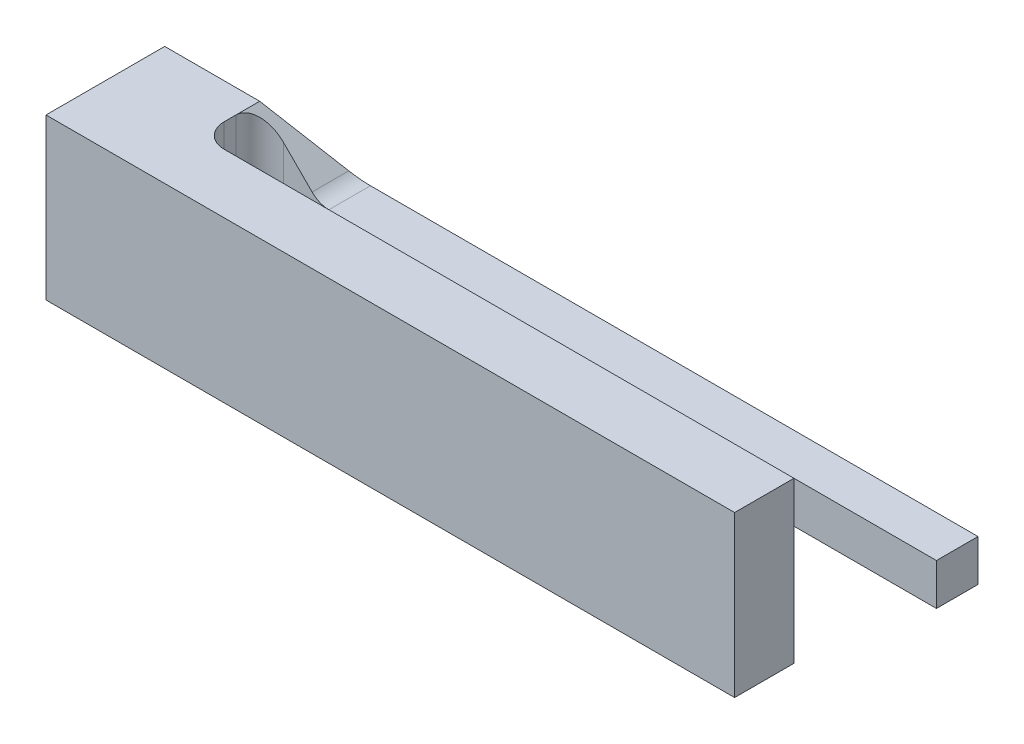
ISO-10303-21;
HEADER;
FILE_DESCRIPTION(('STEP AP214'),'2;1');
FILE_NAME('part.step','',(''),(''),'','','');
FILE_SCHEMA(('AUTOMOTIVE_DESIGN { 1 0 10303 214 1 1 1 1 }'));
ENDSEC;
DATA;
#1=APPLICATION_CONTEXT('core data for automotive mechanical design processes');
#2=APPLICATION_PROTOCOL_DEFINITION('international standard','automotive_design',2000,#1);
#3=PRODUCT_CONTEXT('',#1,'mechanical');
#4=PRODUCT('Part','Part','',(#3));
#5=PRODUCT_RELATED_PRODUCT_CATEGORY('part','',(#4));
#6=PRODUCT_DEFINITION_FORMATION('','',#4);
#7=PRODUCT_DEFINITION_CONTEXT('part definition',#1,'design');
#8=PRODUCT_DEFINITION('design','',#6,#7);
#9=PRODUCT_DEFINITION_SHAPE('','',#8);
#10=(LENGTH_UNIT() NAMED_UNIT(*) SI_UNIT(.MILLI.,.METRE.));
#11=(NAMED_UNIT(*) PLANE_ANGLE_UNIT() SI_UNIT($,.RADIAN.));
#12=(NAMED_UNIT(*) SI_UNIT($,.STERADIAN.) SOLID_ANGLE_UNIT());
#13=UNCERTAINTY_MEASURE_WITH_UNIT(LENGTH_MEASURE(1.E-05),#10,'distance_accuracy_value','');
#14=(GEOMETRIC_REPRESENTATION_CONTEXT(3) GLOBAL_UNCERTAINTY_ASSIGNED_CONTEXT((#13)) GLOBAL_UNIT_ASSIGNED_CONTEXT((#10,
#11,#12)) REPRESENTATION_CONTEXT('',''));
#15=CARTESIAN_POINT('',(0.,0.,0.));
#16=DIRECTION('',(0.,0.,1.));
#17=DIRECTION('',(1.,0.,0.));
#18=AXIS2_PLACEMENT_3D('',#15,#16,#17);
#19=CARTESIAN_POINT('',(-11.5661568524294,0.,13.5));
#20=DIRECTION('',(1.,0.,0.));
#21=DIRECTION('',(0.,1.,0.));
#22=AXIS2_PLACEMENT_3D('',#19,#20,#21);
#23=PLANE('',#22);
#24=DIRECTION('',(0.,0.,-1.));
#25=VECTOR('',#24,1.);
#26=CARTESIAN_POINT('',(-11.5661568524294,4.74903235504116,13.5));
#27=LINE('',#26,#25);
#28=CARTESIAN_POINT('',(-11.5661568524294,4.74903235504116,6.5));
#29=VERTEX_POINT('',#28);
#30=CARTESIAN_POINT('',(-11.5661568524294,4.74903235504116,5.5));
#31=VERTEX_POINT('',#30);
#32=EDGE_CURVE('E61',#29,#31,#27,.T.);
#33=ORIENTED_EDGE('',*,*,#32,.T.);
#34=DIRECTION('',(0.,-1.,0.));
#35=VECTOR('',#34,1.);
#36=CARTESIAN_POINT('',(-11.5661568524294,18.2490323550412,5.5));
#37=LINE('',#36,#35);
#38=CARTESIAN_POINT('',(-11.5661568524293,18.2490323550412,5.4999969652154));
#39=VERTEX_POINT('',#38);
#40=EDGE_CURVE('E264',#31,#39,#37,.F.);
#41=ORIENTED_EDGE('',*,*,#40,.T.);
#42=DIRECTION('',(0.,0.,-1.));
#43=VECTOR('',#42,1.);
#44=CARTESIAN_POINT('',(-11.5661568524294,18.2490323550412,13.5));
#45=LINE('',#44,#43);
#46=CARTESIAN_POINT('',(-11.5661568524294,18.2490323550412,6.5));
#47=VERTEX_POINT('',#46);
#48=EDGE_CURVE('E213',#47,#39,#45,.T.);
#49=ORIENTED_EDGE('',*,*,#48,.F.);
#50=DIRECTION('',(0.,1.,0.));
#51=VECTOR('',#50,1.);
#52=CARTESIAN_POINT('',(-11.5661568524294,0.,6.5));
#53=LINE('',#52,#51);
#54=EDGE_CURVE('E262',#47,#29,#53,.F.);
#55=ORIENTED_EDGE('',*,*,#54,.T.);
#56=EDGE_LOOP('',(#33,#41,#49,#55));
#57=FACE_BOUND('',#56,.T.);
#58=ADVANCED_FACE('F45',(#57),#23,.T.);
#59=CARTESIAN_POINT('',(-14.5661568524294,13.2490323550412,3.5));
#60=DIRECTION('',(0.,-1.,0.));
#61=DIRECTION('',(0.,0.,-1.));
#62=AXIS2_PLACEMENT_3D('',#59,#60,#61);
#63=PLANE('',#62);
#64=DIRECTION('',(-1.,0.,0.));
#65=VECTOR('',#64,1.);
#66=CARTESIAN_POINT('',(-14.5661568524294,13.2490323550412,0.));
#67=LINE('',#66,#65);
#68=CARTESIAN_POINT('',(45.4338431475706,13.2490323550412,0.));
#69=VERTEX_POINT('',#68);
#70=CARTESIAN_POINT('',(-5.73772972768318,13.2490323550412,0.));
#71=VERTEX_POINT('',#70);
#72=EDGE_CURVE('E228',#69,#71,#67,.T.);
#73=ORIENTED_EDGE('',*,*,#72,.T.);
#74=DIRECTION('',(0.,0.,1.));
#75=VECTOR('',#74,1.);
#76=CARTESIAN_POINT('',(-5.73772972768317,13.2490323550412,3.5));
#77=LINE('',#76,#75);
#78=CARTESIAN_POINT('',(-5.73772972768318,13.2490323550412,3.5));
#79=VERTEX_POINT('',#78);
#80=EDGE_CURVE('E249',#71,#79,#77,.T.);
#81=ORIENTED_EDGE('',*,*,#80,.T.);
#82=DIRECTION('',(-1.,0.,0.));
#83=VECTOR('',#82,1.);
#84=CARTESIAN_POINT('',(-14.5661568524294,13.2490323550412,3.5));
#85=LINE('',#84,#83);
#86=CARTESIAN_POINT('',(45.4338431475706,13.2490323550412,3.5));
#87=VERTEX_POINT('',#86);
#88=EDGE_CURVE('E219',#87,#79,#85,.T.);
#89=ORIENTED_EDGE('',*,*,#88,.F.);
#90=DIRECTION('',(0.,0.,-1.));
#91=VECTOR('',#90,1.);
#92=CARTESIAN_POINT('',(45.4338431475706,13.2490323550412,3.5));
#93=LINE('',#92,#91);
#94=EDGE_CURVE('E235',#87,#69,#93,.T.);
#95=ORIENTED_EDGE('',*,*,#94,.T.);
#96=EDGE_LOOP('',(#73,#81,#89,#95));
#97=FACE_BOUND('',#96,.T.);
#98=ADVANCED_FACE('F324',(#97),#63,.F.);
#99=CARTESIAN_POINT('',(-14.5661568524294,9.74903235504116,3.5));
#100=DIRECTION('',(0.,1.,0.));
#101=DIRECTION('',(0.,0.,1.));
#102=AXIS2_PLACEMENT_3D('',#99,#100,#101);
#103=PLANE('',#102);
#104=DIRECTION('',(1.,0.,0.));
#105=VECTOR('',#104,1.);
#106=CARTESIAN_POINT('',(-14.5661568524294,9.74903235504116,3.5));
#107=LINE('',#106,#105);
#108=CARTESIAN_POINT('',(-5.73772972768318,9.74903235504116,3.5));
#109=VERTEX_POINT('',#108);
#110=CARTESIAN_POINT('',(45.4338431475706,9.74903235504116,3.5));
#111=VERTEX_POINT('',#110);
#112=EDGE_CURVE('E223',#109,#111,#107,.T.);
#113=ORIENTED_EDGE('',*,*,#112,.F.);
#114=DIRECTION('',(0.,0.,-1.));
#115=VECTOR('',#114,1.);
#116=CARTESIAN_POINT('',(-5.73772972768317,9.74903235504116,0.));
#117=LINE('',#116,#115);
#118=CARTESIAN_POINT('',(-5.73772972768318,9.74903235504116,0.));
#119=VERTEX_POINT('',#118);
#120=EDGE_CURVE('E254',#109,#119,#117,.T.);
#121=ORIENTED_EDGE('',*,*,#120,.T.);
#122=DIRECTION('',(1.,0.,0.));
#123=VECTOR('',#122,1.);
#124=CARTESIAN_POINT('',(-14.5661568524294,9.74903235504116,0.));
#125=LINE('',#124,#123);
#126=CARTESIAN_POINT('',(45.4338431475706,9.74903235504116,0.));
#127=VERTEX_POINT('',#126);
#128=EDGE_CURVE('E231',#119,#127,#125,.T.);
#129=ORIENTED_EDGE('',*,*,#128,.T.);
#130=DIRECTION('',(0.,0.,-1.));
#131=VECTOR('',#130,1.);
#132=CARTESIAN_POINT('',(45.4338431475706,9.74903235504116,3.5));
#133=LINE('',#132,#131);
#134=EDGE_CURVE('E225',#111,#127,#133,.T.);
#135=ORIENTED_EDGE('',*,*,#134,.F.);
#136=EDGE_LOOP('',(#113,#121,#129,#135));
#137=FACE_BOUND('',#136,.T.);
#138=ADVANCED_FACE('F330',(#137),#103,.F.);
#139=CARTESIAN_POINT('',(0.,0.,3.5));
#140=DIRECTION('',(0.,0.,1.));
#141=DIRECTION('',(1.,0.,0.));
#142=AXIS2_PLACEMENT_3D('',#139,#140,#141);
#143=PLANE('',#142);
#144=DIRECTION('',(-0.707106781186544,0.707106781186551,0.));
#145=VECTOR('',#144,1.);
#146=CARTESIAN_POINT('',(-11.5661568524294,18.2490323550412,3.5));
#147=LINE('',#146,#145);
#148=CARTESIAN_POINT('',(-7.15194329005628,13.8348187926681,3.5));
#149=VERTEX_POINT('',#148);
#150=CARTESIAN_POINT('',(-9.5661568524294,16.2490323550412,3.5));
#151=VERTEX_POINT('',#150);
#152=EDGE_CURVE('E246',#149,#151,#147,.T.);
#153=ORIENTED_EDGE('',*,*,#152,.T.);
#154=DIRECTION('',(0.,-1.,0.));
#155=VECTOR('',#154,1.);
#156=CARTESIAN_POINT('',(-9.5661568524294,4.74903235504116,3.5));
#157=LINE('',#156,#155);
#158=CARTESIAN_POINT('',(-9.5661568524294,6.74903235504109,3.5));
#159=VERTEX_POINT('',#158);
#160=EDGE_CURVE('E259',#151,#159,#157,.T.);
#161=ORIENTED_EDGE('',*,*,#160,.T.);
#162=DIRECTION('',(0.707106781186544,0.707106781186551,0.));
#163=VECTOR('',#162,1.);
#164=CARTESIAN_POINT('',(-11.5661568524294,4.74903235504107,3.5));
#165=LINE('',#164,#163);
#166=CARTESIAN_POINT('',(-7.15194329005627,9.16324591741425,3.5));
#167=VERTEX_POINT('',#166);
#168=EDGE_CURVE('E238',#159,#167,#165,.T.);
#169=ORIENTED_EDGE('',*,*,#168,.T.);
#170=CARTESIAN_POINT('',(-5.73772972768317,7.74903235504116,3.5));
#171=DIRECTION('',(0.,0.,1.));
#172=DIRECTION('',(1.,0.,0.));
#173=AXIS2_PLACEMENT_3D('',#170,#171,#172);
#174=CIRCLE('',#173,2.);
#175=EDGE_CURVE('E275',#167,#109,#174,.F.);
#176=ORIENTED_EDGE('',*,*,#175,.T.);
#177=ORIENTED_EDGE('',*,*,#112,.T.);
#178=DIRECTION('',(0.,1.,0.));
#179=VECTOR('',#178,1.);
#180=CARTESIAN_POINT('',(45.4338431475706,13.2490323550412,3.5));
#181=LINE('',#180,#179);
#182=EDGE_CURVE('E216',#111,#87,#181,.T.);
#183=ORIENTED_EDGE('',*,*,#182,.T.);
#184=ORIENTED_EDGE('',*,*,#88,.T.);
#185=CARTESIAN_POINT('',(-5.73772972768317,15.2490323550412,3.5));
#186=DIRECTION('',(0.,0.,1.));
#187=DIRECTION('',(1.,0.,0.));
#188=AXIS2_PLACEMENT_3D('',#185,#186,#187);
#189=CIRCLE('',#188,2.);
#190=EDGE_CURVE('E269',#79,#149,#189,.F.);
#191=ORIENTED_EDGE('',*,*,#190,.T.);
#192=EDGE_LOOP('',(#153,#161,#169,#176,#177,#183,#184,#191));
#193=FACE_BOUND('',#192,.T.);
#194=ADVANCED_FACE('F335',(#193),#143,.T.);
#195=CARTESIAN_POINT('',(45.4338431475706,13.2490323550412,3.5));
#196=DIRECTION('',(-1.,0.,0.));
#197=DIRECTION('',(0.,0.,1.));
#198=AXIS2_PLACEMENT_3D('',#195,#196,#197);
#199=PLANE('',#198);
#200=DIRECTION('',(0.,1.,0.));
#201=VECTOR('',#200,1.);
#202=CARTESIAN_POINT('',(45.4338431475706,13.2490323550412,0.));
#203=LINE('',#202,#201);
#204=EDGE_CURVE('E215',#127,#69,#203,.T.);
#205=ORIENTED_EDGE('',*,*,#204,.T.);
#206=ORIENTED_EDGE('',*,*,#94,.F.);
#207=ORIENTED_EDGE('',*,*,#182,.F.);
#208=ORIENTED_EDGE('',*,*,#134,.T.);
#209=EDGE_LOOP('',(#205,#206,#207,#208));
#210=FACE_BOUND('',#209,.T.);
#211=ADVANCED_FACE('F338',(#210),#199,.F.);
#212=CARTESIAN_POINT('',(0.,0.,0.));
#213=DIRECTION('',(0.,0.,1.));
#214=DIRECTION('',(1.,0.,0.));
#215=AXIS2_PLACEMENT_3D('',#212,#213,#214);
#216=PLANE('',#215);
#217=ORIENTED_EDGE('',*,*,#204,.F.);
#218=ORIENTED_EDGE('',*,*,#128,.F.);
#219=CARTESIAN_POINT('',(-19.5661568524294,9.74903235504116,0.));
#220=VERTEX_POINT('',#219);
#221=EDGE_CURVE('E220',#220,#119,#125,.T.);
#222=ORIENTED_EDGE('',*,*,#221,.F.);
#223=DIRECTION('',(0.,-1.,0.));
#224=VECTOR('',#223,1.);
#225=CARTESIAN_POINT('',(-19.5661568524294,13.2490323550412,0.));
#226=LINE('',#225,#224);
#227=CARTESIAN_POINT('',(-19.5661568524294,13.2490323550412,0.));
#228=VERTEX_POINT('',#227);
#229=EDGE_CURVE('E173',#228,#220,#226,.T.);
#230=ORIENTED_EDGE('',*,*,#229,.F.);
#231=DIRECTION('',(-1.,0.,0.));
#232=VECTOR('',#231,1.);
#233=CARTESIAN_POINT('',(-11.5661568524294,13.2490323550412,0.));
#234=LINE('',#233,#232);
#235=EDGE_CURVE('E164',#71,#228,#234,.T.);
#236=ORIENTED_EDGE('',*,*,#235,.F.);
#237=ORIENTED_EDGE('',*,*,#72,.F.);
#238=EDGE_LOOP('',(#217,#218,#222,#230,#236,#237));
#239=FACE_BOUND('',#238,.T.);
#240=ADVANCED_FACE('F340',(#239),#216,.F.);
#241=CARTESIAN_POINT('',(0.,18.2490323550412,13.5));
#242=DIRECTION('',(0.,1.,0.));
#243=DIRECTION('',(0.,0.,1.));
#244=AXIS2_PLACEMENT_3D('',#241,#242,#243);
#245=PLANE('',#244);
#246=DIRECTION('',(1.,0.,0.));
#247=VECTOR('',#246,1.);
#248=CARTESIAN_POINT('',(0.,18.2490323550412,3.5));
#249=LINE('',#248,#247);
#250=CARTESIAN_POINT('',(-19.5661568524294,18.2490323550412,3.5));
#251=VERTEX_POINT('',#250);
#252=CARTESIAN_POINT('',(-11.5661568524294,18.2490323550412,3.5));
#253=VERTEX_POINT('',#252);
#254=EDGE_CURVE('E154',#251,#253,#249,.T.);
#255=ORIENTED_EDGE('',*,*,#254,.F.);
#256=DIRECTION('',(0.,0.,-1.));
#257=VECTOR('',#256,1.);
#258=CARTESIAN_POINT('',(-19.5661568524294,18.2490323550412,13.5));
#259=LINE('',#258,#257);
#260=CARTESIAN_POINT('',(-19.5661568524294,18.2490323550412,13.5));
#261=VERTEX_POINT('',#260);
#262=EDGE_CURVE('E158',#261,#251,#259,.T.);
#263=ORIENTED_EDGE('',*,*,#262,.F.);
#264=DIRECTION('',(1.,0.,0.));
#265=VECTOR('',#264,1.);
#266=CARTESIAN_POINT('',(0.,18.2490323550412,13.5));
#267=LINE('',#266,#265);
#268=CARTESIAN_POINT('',(38.4338431475706,18.2490323550413,13.5));
#269=VERTEX_POINT('',#268);
#270=EDGE_CURVE('E206',#261,#269,#267,.T.);
#271=ORIENTED_EDGE('',*,*,#270,.T.);
#272=DIRECTION('',(0.,0.,-1.));
#273=VECTOR('',#272,1.);
#274=CARTESIAN_POINT('',(38.4338431475706,18.2490323550412,0.));
#275=LINE('',#274,#273);
#276=CARTESIAN_POINT('',(38.4338431475706,18.2490323550412,8.5));
#277=VERTEX_POINT('',#276);
#278=EDGE_CURVE('E196',#269,#277,#275,.T.);
#279=ORIENTED_EDGE('',*,*,#278,.T.);
#280=DIRECTION('',(-1.,0.,0.));
#281=VECTOR('',#280,1.);
#282=CARTESIAN_POINT('',(38.4338431475706,18.2490323550412,8.5));
#283=LINE('',#282,#281);
#284=CARTESIAN_POINT('',(-9.5661568524294,18.2490323550412,8.5));
#285=VERTEX_POINT('',#284);
#286=EDGE_CURVE('E199',#277,#285,#283,.T.);
#287=ORIENTED_EDGE('',*,*,#286,.T.);
#288=CARTESIAN_POINT('',(-9.56615685242941,18.2490323550412,6.5));
#289=DIRECTION('',(0.,1.,0.));
#290=DIRECTION('',(0.,0.,1.));
#291=AXIS2_PLACEMENT_3D('',#288,#289,#290);
#292=CIRCLE('',#291,2.);
#293=EDGE_CURVE('E281',#285,#47,#292,.F.);
#294=ORIENTED_EDGE('',*,*,#293,.T.);
#295=ORIENTED_EDGE('',*,*,#48,.T.);
#296=DIRECTION('',(0.,0.,1.));
#297=VECTOR('',#296,1.);
#298=CARTESIAN_POINT('',(-11.5661568524293,18.2490323550412,13.5));
#299=LINE('',#298,#297);
#300=EDGE_CURVE('E11',#253,#39,#299,.T.);
#301=ORIENTED_EDGE('',*,*,#300,.F.);
#302=EDGE_LOOP('',(#255,#263,#271,#279,#287,#294,#295,#301));
#303=FACE_BOUND('',#302,.T.);
#304=ADVANCED_FACE('F156',(#303),#245,.T.);
#305=CARTESIAN_POINT('',(0.,4.74903235504116,13.5));
#306=DIRECTION('',(0.,1.,0.));
#307=DIRECTION('',(0.,0.,1.));
#308=AXIS2_PLACEMENT_3D('',#305,#306,#307);
#309=PLANE('',#308);
#310=DIRECTION('',(1.,0.,0.));
#311=VECTOR('',#310,1.);
#312=CARTESIAN_POINT('',(0.,4.74903235504116,3.5));
#313=LINE('',#312,#311);
#314=CARTESIAN_POINT('',(-19.5661568524294,4.74903235504116,3.5));
#315=VERTEX_POINT('',#314);
#316=CARTESIAN_POINT('',(-11.5661568524294,4.74903235504116,3.5));
#317=VERTEX_POINT('',#316);
#318=EDGE_CURVE('E163',#315,#317,#313,.T.);
#319=ORIENTED_EDGE('',*,*,#318,.T.);
#320=DIRECTION('',(0.,0.,1.));
#321=VECTOR('',#320,1.);
#322=CARTESIAN_POINT('',(-11.5661568524293,4.74903235504116,13.5));
#323=LINE('',#322,#321);
#324=EDGE_CURVE('E54',#317,#31,#323,.T.);
#325=ORIENTED_EDGE('',*,*,#324,.T.);
#326=ORIENTED_EDGE('',*,*,#32,.F.);
#327=CARTESIAN_POINT('',(-9.5661568524294,4.74903235504116,6.5));
#328=DIRECTION('',(0.,1.,0.));
#329=DIRECTION('',(0.,0.,1.));
#330=AXIS2_PLACEMENT_3D('',#327,#328,#329);
#331=CIRCLE('',#330,2.);
#332=CARTESIAN_POINT('',(-9.5661568524294,4.74903235504116,8.5));
#333=VERTEX_POINT('',#332);
#334=EDGE_CURVE('E283',#29,#333,#331,.T.);
#335=ORIENTED_EDGE('',*,*,#334,.T.);
#336=DIRECTION('',(-1.,0.,0.));
#337=VECTOR('',#336,1.);
#338=CARTESIAN_POINT('',(38.4338431475706,4.74903235504116,8.5));
#339=LINE('',#338,#337);
#340=CARTESIAN_POINT('',(38.4338431475706,4.74903235504116,8.5));
#341=VERTEX_POINT('',#340);
#342=EDGE_CURVE('E202',#341,#333,#339,.T.);
#343=ORIENTED_EDGE('',*,*,#342,.F.);
#344=DIRECTION('',(0.,0.,-1.));
#345=VECTOR('',#344,1.);
#346=CARTESIAN_POINT('',(38.4338431475706,4.74903235504116,0.));
#347=LINE('',#346,#345);
#348=CARTESIAN_POINT('',(38.4338431475706,4.74903235504116,13.5));
#349=VERTEX_POINT('',#348);
#350=EDGE_CURVE('E192',#349,#341,#347,.T.);
#351=ORIENTED_EDGE('',*,*,#350,.F.);
#352=DIRECTION('',(1.,0.,0.));
#353=VECTOR('',#352,1.);
#354=CARTESIAN_POINT('',(0.,4.74903235504116,13.5));
#355=LINE('',#354,#353);
#356=CARTESIAN_POINT('',(-19.5661568524294,4.74903235504116,13.5));
#357=VERTEX_POINT('',#356);
#358=EDGE_CURVE('E208',#357,#349,#355,.T.);
#359=ORIENTED_EDGE('',*,*,#358,.F.);
#360=DIRECTION('',(0.,0.,1.));
#361=VECTOR('',#360,1.);
#362=CARTESIAN_POINT('',(-19.5661568524294,4.74903235504116,3.5));
#363=LINE('',#362,#361);
#364=EDGE_CURVE('E186',#315,#357,#363,.T.);
#365=ORIENTED_EDGE('',*,*,#364,.F.);
#366=EDGE_LOOP('',(#319,#325,#326,#335,#343,#351,#359,#365));
#367=FACE_BOUND('',#366,.T.);
#368=ADVANCED_FACE('F287',(#367),#309,.F.);
#369=CARTESIAN_POINT('',(0.,0.,13.5));
#370=DIRECTION('',(0.,0.,1.));
#371=DIRECTION('',(1.,0.,0.));
#372=AXIS2_PLACEMENT_3D('',#369,#370,#371);
#373=PLANE('',#372);
#374=ORIENTED_EDGE('',*,*,#358,.T.);
#375=DIRECTION('',(0.,-1.,0.));
#376=VECTOR('',#375,1.);
#377=CARTESIAN_POINT('',(38.4338431475706,0.,13.5));
#378=LINE('',#377,#376);
#379=EDGE_CURVE('E189',#269,#349,#378,.T.);
#380=ORIENTED_EDGE('',*,*,#379,.F.);
#381=ORIENTED_EDGE('',*,*,#270,.F.);
#382=DIRECTION('',(0.,1.,0.));
#383=VECTOR('',#382,1.);
#384=CARTESIAN_POINT('',(-19.5661568524294,4.74903235504116,13.5));
#385=LINE('',#384,#383);
#386=EDGE_CURVE('E179',#357,#261,#385,.T.);
#387=ORIENTED_EDGE('',*,*,#386,.F.);
#388=EDGE_LOOP('',(#374,#380,#381,#387));
#389=FACE_BOUND('',#388,.T.);
#390=ADVANCED_FACE('F311',(#389),#373,.T.);
#391=CARTESIAN_POINT('',(-11.5661568524294,3.20605762011421,4.58008231444887));
#392=DIRECTION('',(0.,-0.573462344363328,-0.81923192051904));
#393=DIRECTION('',(0.,0.81923192051904,-0.573462344363328));
#394=AXIS2_PLACEMENT_3D('',#391,#392,#393);
#395=PLANE('',#394);
#396=ORIENTED_EDGE('',*,*,#318,.F.);
#397=DIRECTION('',(0.,-0.81923192051904,0.573462344363328));
#398=VECTOR('',#397,1.);
#399=CARTESIAN_POINT('',(-19.5661568524294,9.74903235504116,0.));
#400=LINE('',#399,#398);
#401=EDGE_CURVE('E183',#220,#315,#400,.T.);
#402=ORIENTED_EDGE('',*,*,#401,.F.);
#403=ORIENTED_EDGE('',*,*,#221,.T.);
#404=CARTESIAN_POINT('',(-5.73772972768317,7.74903235504116,1.4));
#405=DIRECTION('',(0.,-0.573462344363328,-0.81923192051904));
#406=DIRECTION('',(0.,-0.81923192051904,0.573462344363328));
#407=AXIS2_PLACEMENT_3D('',#404,#405,#406);
#408=ELLIPSE('',#407,2.44131112314674,2.);
#409=CARTESIAN_POINT('',(-7.15194329005627,9.16324591741425,0.410050506338837));
#410=VERTEX_POINT('',#409);
#411=EDGE_CURVE('E273',#119,#410,#408,.F.);
#412=ORIENTED_EDGE('',*,*,#411,.T.);
#413=DIRECTION('',(-0.633724250524474,-0.633724250524481,0.443606975367137));
#414=VECTOR('',#413,1.);
#415=CARTESIAN_POINT('',(-14.3774018323491,1.93778737512139,5.46787148594384));
#416=LINE('',#415,#414);
#417=EDGE_CURVE('E241',#410,#317,#416,.T.);
#418=ORIENTED_EDGE('',*,*,#417,.T.);
#419=EDGE_LOOP('',(#396,#402,#403,#412,#418));
#420=FACE_BOUND('',#419,.T.);
#421=ADVANCED_FACE('F313',(#420),#395,.T.);
#422=CARTESIAN_POINT('',(-11.5661568524294,4.3570643315236,-6.22437761646229));
#423=DIRECTION('',(0.,0.573462344363328,-0.819231920519041));
#424=DIRECTION('',(0.,0.819231920519041,0.573462344363328));
#425=AXIS2_PLACEMENT_3D('',#422,#423,#424);
#426=PLANE('',#425);
#427=ORIENTED_EDGE('',*,*,#235,.T.);
#428=DIRECTION('',(0.,-0.819231920519041,-0.573462344363328));
#429=VECTOR('',#428,1.);
#430=CARTESIAN_POINT('',(-19.5661568524294,18.2490323550412,3.5));
#431=LINE('',#430,#429);
#432=EDGE_CURVE('E167',#251,#228,#431,.T.);
#433=ORIENTED_EDGE('',*,*,#432,.F.);
#434=ORIENTED_EDGE('',*,*,#254,.T.);
#435=DIRECTION('',(0.633724250524474,-0.633724250524481,-0.443606975367136));
#436=VECTOR('',#435,1.);
#437=CARTESIAN_POINT('',(-14.3774018323491,21.0602773349609,5.46787148594384));
#438=LINE('',#437,#436);
#439=CARTESIAN_POINT('',(-7.15194329005627,13.8348187926681,0.410050506338835));
#440=VERTEX_POINT('',#439);
#441=EDGE_CURVE('E244',#253,#440,#438,.T.);
#442=ORIENTED_EDGE('',*,*,#441,.T.);
#443=CARTESIAN_POINT('',(-5.73772972768317,15.2490323550412,1.4));
#444=DIRECTION('',(0.,0.573462344363328,-0.819231920519041));
#445=DIRECTION('',(0.,-0.819231920519041,-0.573462344363328));
#446=AXIS2_PLACEMENT_3D('',#443,#444,#445);
#447=ELLIPSE('',#446,2.44131112314674,2.);
#448=EDGE_CURVE('E271',#440,#71,#447,.F.);
#449=ORIENTED_EDGE('',*,*,#448,.T.);
#450=EDGE_LOOP('',(#427,#433,#434,#442,#449));
#451=FACE_BOUND('',#450,.T.);
#452=ADVANCED_FACE('F168',(#451),#426,.T.);
#453=CARTESIAN_POINT('',(38.4338431475706,0.,8.5));
#454=DIRECTION('',(0.,0.,1.));
#455=DIRECTION('',(1.,0.,0.));
#456=AXIS2_PLACEMENT_3D('',#453,#454,#455);
#457=PLANE('',#456);
#458=ORIENTED_EDGE('',*,*,#342,.T.);
#459=DIRECTION('',(0.,1.,0.));
#460=VECTOR('',#459,1.);
#461=CARTESIAN_POINT('',(-9.5661568524294,0.,8.5));
#462=LINE('',#461,#460);
#463=EDGE_CURVE('E266',#333,#285,#462,.T.);
#464=ORIENTED_EDGE('',*,*,#463,.T.);
#465=ORIENTED_EDGE('',*,*,#286,.F.);
#466=DIRECTION('',(0.,1.,0.));
#467=VECTOR('',#466,1.);
#468=CARTESIAN_POINT('',(38.4338431475706,0.,8.5));
#469=LINE('',#468,#467);
#470=EDGE_CURVE('E194',#341,#277,#469,.T.);
#471=ORIENTED_EDGE('',*,*,#470,.F.);
#472=EDGE_LOOP('',(#458,#464,#465,#471));
#473=FACE_BOUND('',#472,.T.);
#474=ADVANCED_FACE('F302',(#473),#457,.F.);
#475=CARTESIAN_POINT('',(38.4338431475706,0.,0.));
#476=DIRECTION('',(1.,0.,0.));
#477=DIRECTION('',(0.,1.,0.));
#478=AXIS2_PLACEMENT_3D('',#475,#476,#477);
#479=PLANE('',#478);
#480=ORIENTED_EDGE('',*,*,#379,.T.);
#481=ORIENTED_EDGE('',*,*,#350,.T.);
#482=ORIENTED_EDGE('',*,*,#470,.T.);
#483=ORIENTED_EDGE('',*,*,#278,.F.);
#484=EDGE_LOOP('',(#480,#481,#482,#483));
#485=FACE_BOUND('',#484,.T.);
#486=ADVANCED_FACE('F309',(#485),#479,.T.);
#487=CARTESIAN_POINT('',(-11.5661568524294,4.74903235504107,13.5));
#488=DIRECTION('',(-0.707106781186551,0.707106781186544,0.));
#489=DIRECTION('',(0.,0.,1.));
#490=AXIS2_PLACEMENT_3D('',#487,#488,#489);
#491=PLANE('',#490);
#492=ORIENTED_EDGE('',*,*,#417,.F.);
#493=DIRECTION('',(0.,0.,-1.));
#494=VECTOR('',#493,1.);
#495=CARTESIAN_POINT('',(-7.15194329005628,9.16324591741425,3.5));
#496=LINE('',#495,#494);
#497=EDGE_CURVE('E257',#410,#167,#496,.F.);
#498=ORIENTED_EDGE('',*,*,#497,.T.);
#499=ORIENTED_EDGE('',*,*,#168,.F.);
#500=CARTESIAN_POINT('',(-9.5661568524294,6.74903235504109,5.5));
#501=DIRECTION('',(-0.707106781186551,0.707106781186544,0.));
#502=DIRECTION('',(0.707106781186544,0.707106781186551,0.));
#503=AXIS2_PLACEMENT_3D('',#500,#501,#502);
#504=ELLIPSE('',#503,2.8284271247462,2.);
#505=EDGE_CURVE('E277',#159,#31,#504,.T.);
#506=ORIENTED_EDGE('',*,*,#505,.T.);
#507=ORIENTED_EDGE('',*,*,#324,.F.);
#508=EDGE_LOOP('',(#492,#498,#499,#506,#507));
#509=FACE_BOUND('',#508,.T.);
#510=ADVANCED_FACE('F351',(#509),#491,.F.);
#511=CARTESIAN_POINT('',(-11.5661568524294,18.2490323550412,13.5));
#512=DIRECTION('',(-0.707106781186551,-0.707106781186544,0.));
#513=DIRECTION('',(0.,0.,-1.));
#514=AXIS2_PLACEMENT_3D('',#511,#512,#513);
#515=PLANE('',#514);
#516=ORIENTED_EDGE('',*,*,#152,.F.);
#517=DIRECTION('',(0.,0.,1.));
#518=VECTOR('',#517,1.);
#519=CARTESIAN_POINT('',(-7.15194329005628,13.8348187926681,0.));
#520=LINE('',#519,#518);
#521=EDGE_CURVE('E252',#149,#440,#520,.F.);
#522=ORIENTED_EDGE('',*,*,#521,.T.);
#523=ORIENTED_EDGE('',*,*,#441,.F.);
#524=ORIENTED_EDGE('',*,*,#300,.T.);
#525=CARTESIAN_POINT('',(-9.5661568524294,16.2490323550412,5.5));
#526=DIRECTION('',(-0.707106781186551,-0.707106781186544,0.));
#527=DIRECTION('',(-0.707106781186544,0.707106781186551,0.));
#528=AXIS2_PLACEMENT_3D('',#525,#526,#527);
#529=ELLIPSE('',#528,2.82842712474621,2.);
#530=EDGE_CURVE('E279',#39,#151,#529,.T.);
#531=ORIENTED_EDGE('',*,*,#530,.T.);
#532=EDGE_LOOP('',(#516,#522,#523,#524,#531));
#533=FACE_BOUND('',#532,.T.);
#534=ADVANCED_FACE('F357',(#533),#515,.F.);
#535=CARTESIAN_POINT('',(-5.73772972768317,15.2490323550412,3.5));
#536=DIRECTION('',(0.,0.,-1.));
#537=DIRECTION('',(-1.,0.,0.));
#538=AXIS2_PLACEMENT_3D('',#535,#536,#537);
#539=CYLINDRICAL_SURFACE('',#538,2.);
#540=ORIENTED_EDGE('',*,*,#448,.F.);
#541=ORIENTED_EDGE('',*,*,#521,.F.);
#542=ORIENTED_EDGE('',*,*,#190,.F.);
#543=ORIENTED_EDGE('',*,*,#80,.F.);
#544=EDGE_LOOP('',(#540,#541,#542,#543));
#545=FACE_BOUND('',#544,.T.);
#546=ADVANCED_FACE('F362',(#545),#539,.F.);
#547=CARTESIAN_POINT('',(-5.73772972768317,7.74903235504116,3.5));
#548=DIRECTION('',(0.,0.,1.));
#549=DIRECTION('',(1.,0.,0.));
#550=AXIS2_PLACEMENT_3D('',#547,#548,#549);
#551=CYLINDRICAL_SURFACE('',#550,2.);
#552=ORIENTED_EDGE('',*,*,#175,.F.);
#553=ORIENTED_EDGE('',*,*,#497,.F.);
#554=ORIENTED_EDGE('',*,*,#411,.F.);
#555=ORIENTED_EDGE('',*,*,#120,.F.);
#556=EDGE_LOOP('',(#552,#553,#554,#555));
#557=FACE_BOUND('',#556,.T.);
#558=ADVANCED_FACE('F366',(#557),#551,.F.);
#559=CARTESIAN_POINT('',(-9.5661568524294,0.,5.5));
#560=DIRECTION('',(0.,1.,0.));
#561=DIRECTION('',(-1.,0.,0.));
#562=AXIS2_PLACEMENT_3D('',#559,#560,#561);
#563=CYLINDRICAL_SURFACE('',#562,2.);
#564=ORIENTED_EDGE('',*,*,#530,.F.);
#565=ORIENTED_EDGE('',*,*,#40,.F.);
#566=ORIENTED_EDGE('',*,*,#505,.F.);
#567=ORIENTED_EDGE('',*,*,#160,.F.);
#568=EDGE_LOOP('',(#564,#565,#566,#567));
#569=FACE_BOUND('',#568,.T.);
#570=ADVANCED_FACE('F294',(#569),#563,.F.);
#571=CARTESIAN_POINT('',(-9.5661568524294,0.,6.5));
#572=DIRECTION('',(0.,1.,0.));
#573=DIRECTION('',(-1.,0.,0.));
#574=AXIS2_PLACEMENT_3D('',#571,#572,#573);
#575=CYLINDRICAL_SURFACE('',#574,2.);
#576=ORIENTED_EDGE('',*,*,#334,.F.);
#577=ORIENTED_EDGE('',*,*,#54,.F.);
#578=ORIENTED_EDGE('',*,*,#293,.F.);
#579=ORIENTED_EDGE('',*,*,#463,.F.);
#580=EDGE_LOOP('',(#576,#577,#578,#579));
#581=FACE_BOUND('',#580,.T.);
#582=ADVANCED_FACE('F47',(#581),#575,.F.);
#583=CARTESIAN_POINT('',(-19.5661568524294,0.,0.));
#584=DIRECTION('',(-1.,0.,0.));
#585=DIRECTION('',(0.,0.,1.));
#586=AXIS2_PLACEMENT_3D('',#583,#584,#585);
#587=PLANE('',#586);
#588=ORIENTED_EDGE('',*,*,#262,.T.);
#589=ORIENTED_EDGE('',*,*,#432,.T.);
#590=ORIENTED_EDGE('',*,*,#229,.T.);
#591=ORIENTED_EDGE('',*,*,#401,.T.);
#592=ORIENTED_EDGE('',*,*,#364,.T.);
#593=ORIENTED_EDGE('',*,*,#386,.T.);
#594=EDGE_LOOP('',(#588,#589,#590,#591,#592,#593));
#595=FACE_BOUND('',#594,.T.);
#596=ADVANCED_FACE('F176',(#595),#587,.T.);
#597=CLOSED_SHELL('',(#58,#98,#138,#194,#211,#240,#304,#368,#390,#421,#452,#474,#486,#510,#534,
#546,#558,#570,#582,#596));
#598=MANIFOLD_SOLID_BREP('B2',#597);
#599=ADVANCED_BREP_SHAPE_REPRESENTATION('',(#18,#598),#14);
#600=SHAPE_DEFINITION_REPRESENTATION(#9,#599);
ENDSEC;
END-ISO-10303-21;
